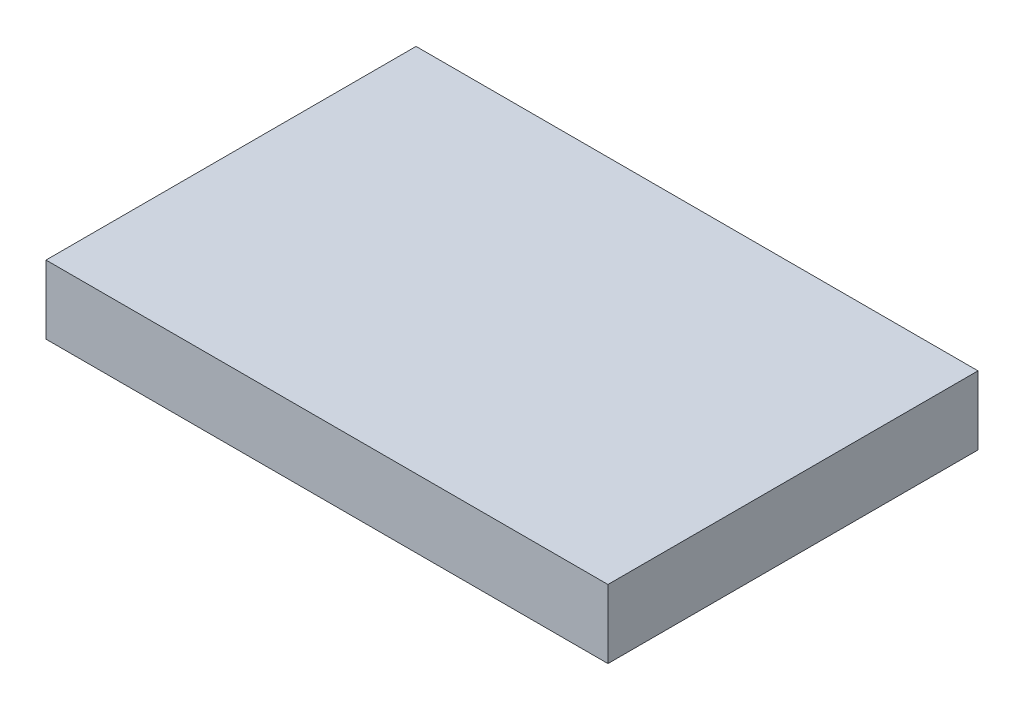
ISO-10303-21;
HEADER;
FILE_DESCRIPTION(('STEP AP214'),'2;1');
FILE_NAME('part.step','',(''),(''),'','','');
FILE_SCHEMA(('AUTOMOTIVE_DESIGN { 1 0 10303 214 1 1 1 1 }'));
ENDSEC;
DATA;
#1=APPLICATION_CONTEXT('core data for automotive mechanical design processes');
#2=APPLICATION_PROTOCOL_DEFINITION('international standard','automotive_design',2000,#1);
#3=PRODUCT_CONTEXT('',#1,'mechanical');
#4=PRODUCT('Part','Part','',(#3));
#5=PRODUCT_RELATED_PRODUCT_CATEGORY('part','',(#4));
#6=PRODUCT_DEFINITION_FORMATION('','',#4);
#7=PRODUCT_DEFINITION_CONTEXT('part definition',#1,'design');
#8=PRODUCT_DEFINITION('design','',#6,#7);
#9=PRODUCT_DEFINITION_SHAPE('','',#8);
#10=(LENGTH_UNIT() NAMED_UNIT(*) SI_UNIT(.MILLI.,.METRE.));
#11=(NAMED_UNIT(*) PLANE_ANGLE_UNIT() SI_UNIT($,.RADIAN.));
#12=(NAMED_UNIT(*) SI_UNIT($,.STERADIAN.) SOLID_ANGLE_UNIT());
#13=UNCERTAINTY_MEASURE_WITH_UNIT(LENGTH_MEASURE(1.E-05),#10,'distance_accuracy_value','');
#14=(GEOMETRIC_REPRESENTATION_CONTEXT(3) GLOBAL_UNCERTAINTY_ASSIGNED_CONTEXT((#13)) GLOBAL_UNIT_ASSIGNED_CONTEXT((#10,
#11,#12)) REPRESENTATION_CONTEXT('',''));
#15=CARTESIAN_POINT('',(0.,0.,0.));
#16=DIRECTION('',(0.,0.,1.));
#17=DIRECTION('',(1.,0.,0.));
#18=AXIS2_PLACEMENT_3D('',#15,#16,#17);
#19=CARTESIAN_POINT('',(0.,10.,0.));
#20=DIRECTION('',(1.,0.,0.));
#21=DIRECTION('',(0.,0.,-1.));
#22=AXIS2_PLACEMENT_3D('',#19,#20,#21);
#23=PLANE('',#22);
#24=DIRECTION('',(0.,0.,1.));
#25=VECTOR('',#24,1.);
#26=CARTESIAN_POINT('',(0.,0.,0.));
#27=LINE('',#26,#25);
#28=CARTESIAN_POINT('',(0.,0.,-54.));
#29=VERTEX_POINT('',#28);
#30=CARTESIAN_POINT('',(0.,0.,0.));
#31=VERTEX_POINT('',#30);
#32=EDGE_CURVE('E102',#29,#31,#27,.T.);
#33=ORIENTED_EDGE('',*,*,#32,.T.);
#34=DIRECTION('',(0.,-1.,0.));
#35=VECTOR('',#34,1.);
#36=CARTESIAN_POINT('',(0.,10.,0.));
#37=LINE('',#36,#35);
#38=CARTESIAN_POINT('',(0.,10.,0.));
#39=VERTEX_POINT('',#38);
#40=EDGE_CURVE('E11',#39,#31,#37,.T.);
#41=ORIENTED_EDGE('',*,*,#40,.F.);
#42=DIRECTION('',(0.,0.,1.));
#43=VECTOR('',#42,1.);
#44=CARTESIAN_POINT('',(0.,10.,0.));
#45=LINE('',#44,#43);
#46=CARTESIAN_POINT('',(0.,10.,-54.));
#47=VERTEX_POINT('',#46);
#48=EDGE_CURVE('E90',#47,#39,#45,.T.);
#49=ORIENTED_EDGE('',*,*,#48,.F.);
#50=DIRECTION('',(0.,-1.,0.));
#51=VECTOR('',#50,1.);
#52=CARTESIAN_POINT('',(0.,10.,-54.));
#53=LINE('',#52,#51);
#54=EDGE_CURVE('E98',#47,#29,#53,.T.);
#55=ORIENTED_EDGE('',*,*,#54,.T.);
#56=EDGE_LOOP('',(#33,#41,#49,#55));
#57=FACE_BOUND('',#56,.T.);
#58=ADVANCED_FACE('F39',(#57),#23,.F.);
#59=CARTESIAN_POINT('',(0.,10.,0.));
#60=DIRECTION('',(0.,0.,-1.));
#61=DIRECTION('',(-1.,0.,0.));
#62=AXIS2_PLACEMENT_3D('',#59,#60,#61);
#63=PLANE('',#62);
#64=DIRECTION('',(1.,0.,0.));
#65=VECTOR('',#64,1.);
#66=CARTESIAN_POINT('',(0.,0.,0.));
#67=LINE('',#66,#65);
#68=CARTESIAN_POINT('',(82.,0.,0.));
#69=VERTEX_POINT('',#68);
#70=EDGE_CURVE('E94',#31,#69,#67,.T.);
#71=ORIENTED_EDGE('',*,*,#70,.T.);
#72=DIRECTION('',(0.,-1.,0.));
#73=VECTOR('',#72,1.);
#74=CARTESIAN_POINT('',(82.,10.,0.));
#75=LINE('',#74,#73);
#76=CARTESIAN_POINT('',(82.,10.,0.));
#77=VERTEX_POINT('',#76);
#78=EDGE_CURVE('E47',#77,#69,#75,.T.);
#79=ORIENTED_EDGE('',*,*,#78,.F.);
#80=DIRECTION('',(1.,0.,0.));
#81=VECTOR('',#80,1.);
#82=CARTESIAN_POINT('',(0.,10.,0.));
#83=LINE('',#82,#81);
#84=EDGE_CURVE('E85',#39,#77,#83,.T.);
#85=ORIENTED_EDGE('',*,*,#84,.F.);
#86=ORIENTED_EDGE('',*,*,#40,.T.);
#87=EDGE_LOOP('',(#71,#79,#85,#86));
#88=FACE_BOUND('',#87,.T.);
#89=ADVANCED_FACE('F93',(#88),#63,.F.);
#90=CARTESIAN_POINT('',(82.,10.,0.));
#91=DIRECTION('',(-1.,0.,0.));
#92=DIRECTION('',(0.,0.,1.));
#93=AXIS2_PLACEMENT_3D('',#90,#91,#92);
#94=PLANE('',#93);
#95=DIRECTION('',(0.,0.,-1.));
#96=VECTOR('',#95,1.);
#97=CARTESIAN_POINT('',(82.,0.,0.));
#98=LINE('',#97,#96);
#99=CARTESIAN_POINT('',(82.,0.,-54.));
#100=VERTEX_POINT('',#99);
#101=EDGE_CURVE('E72',#69,#100,#98,.T.);
#102=ORIENTED_EDGE('',*,*,#101,.T.);
#103=DIRECTION('',(0.,-1.,0.));
#104=VECTOR('',#103,1.);
#105=CARTESIAN_POINT('',(82.,10.,-54.));
#106=LINE('',#105,#104);
#107=CARTESIAN_POINT('',(82.,10.,-54.));
#108=VERTEX_POINT('',#107);
#109=EDGE_CURVE('E95',#108,#100,#106,.T.);
#110=ORIENTED_EDGE('',*,*,#109,.F.);
#111=DIRECTION('',(0.,0.,-1.));
#112=VECTOR('',#111,1.);
#113=CARTESIAN_POINT('',(82.,10.,0.));
#114=LINE('',#113,#112);
#115=EDGE_CURVE('E88',#77,#108,#114,.T.);
#116=ORIENTED_EDGE('',*,*,#115,.F.);
#117=ORIENTED_EDGE('',*,*,#78,.T.);
#118=EDGE_LOOP('',(#102,#110,#116,#117));
#119=FACE_BOUND('',#118,.T.);
#120=ADVANCED_FACE('F96',(#119),#94,.F.);
#121=CARTESIAN_POINT('',(0.,10.,-54.));
#122=DIRECTION('',(0.,0.,1.));
#123=DIRECTION('',(1.,0.,0.));
#124=AXIS2_PLACEMENT_3D('',#121,#122,#123);
#125=PLANE('',#124);
#126=DIRECTION('',(-1.,0.,0.));
#127=VECTOR('',#126,1.);
#128=CARTESIAN_POINT('',(0.,0.,-54.));
#129=LINE('',#128,#127);
#130=EDGE_CURVE('E78',#100,#29,#129,.T.);
#131=ORIENTED_EDGE('',*,*,#130,.T.);
#132=ORIENTED_EDGE('',*,*,#54,.F.);
#133=DIRECTION('',(-1.,0.,0.));
#134=VECTOR('',#133,1.);
#135=CARTESIAN_POINT('',(0.,10.,-54.));
#136=LINE('',#135,#134);
#137=EDGE_CURVE('E55',#108,#47,#136,.T.);
#138=ORIENTED_EDGE('',*,*,#137,.F.);
#139=ORIENTED_EDGE('',*,*,#109,.T.);
#140=EDGE_LOOP('',(#131,#132,#138,#139));
#141=FACE_BOUND('',#140,.T.);
#142=ADVANCED_FACE('F109',(#141),#125,.F.);
#143=CARTESIAN_POINT('',(0.,10.,0.));
#144=DIRECTION('',(0.,-1.,0.));
#145=DIRECTION('',(0.,0.,-1.));
#146=AXIS2_PLACEMENT_3D('',#143,#144,#145);
#147=PLANE('',#146);
#148=ORIENTED_EDGE('',*,*,#48,.T.);
#149=ORIENTED_EDGE('',*,*,#84,.T.);
#150=ORIENTED_EDGE('',*,*,#115,.T.);
#151=ORIENTED_EDGE('',*,*,#137,.T.);
#152=EDGE_LOOP('',(#148,#149,#150,#151));
#153=FACE_BOUND('',#152,.T.);
#154=ADVANCED_FACE('F86',(#153),#147,.F.);
#155=CARTESIAN_POINT('',(0.,0.,0.));
#156=DIRECTION('',(0.,-1.,0.));
#157=DIRECTION('',(0.,0.,-1.));
#158=AXIS2_PLACEMENT_3D('',#155,#156,#157);
#159=PLANE('',#158);
#160=ORIENTED_EDGE('',*,*,#32,.F.);
#161=ORIENTED_EDGE('',*,*,#130,.F.);
#162=ORIENTED_EDGE('',*,*,#101,.F.);
#163=ORIENTED_EDGE('',*,*,#70,.F.);
#164=EDGE_LOOP('',(#160,#161,#162,#163));
#165=FACE_BOUND('',#164,.T.);
#166=ADVANCED_FACE('F112',(#165),#159,.T.);
#167=CLOSED_SHELL('',(#58,#89,#120,#142,#154,#166));
#168=MANIFOLD_SOLID_BREP('B2',#167);
#169=ADVANCED_BREP_SHAPE_REPRESENTATION('',(#18,#168),#14);
#170=SHAPE_DEFINITION_REPRESENTATION(#9,#169);
ENDSEC;
END-ISO-10303-21;
